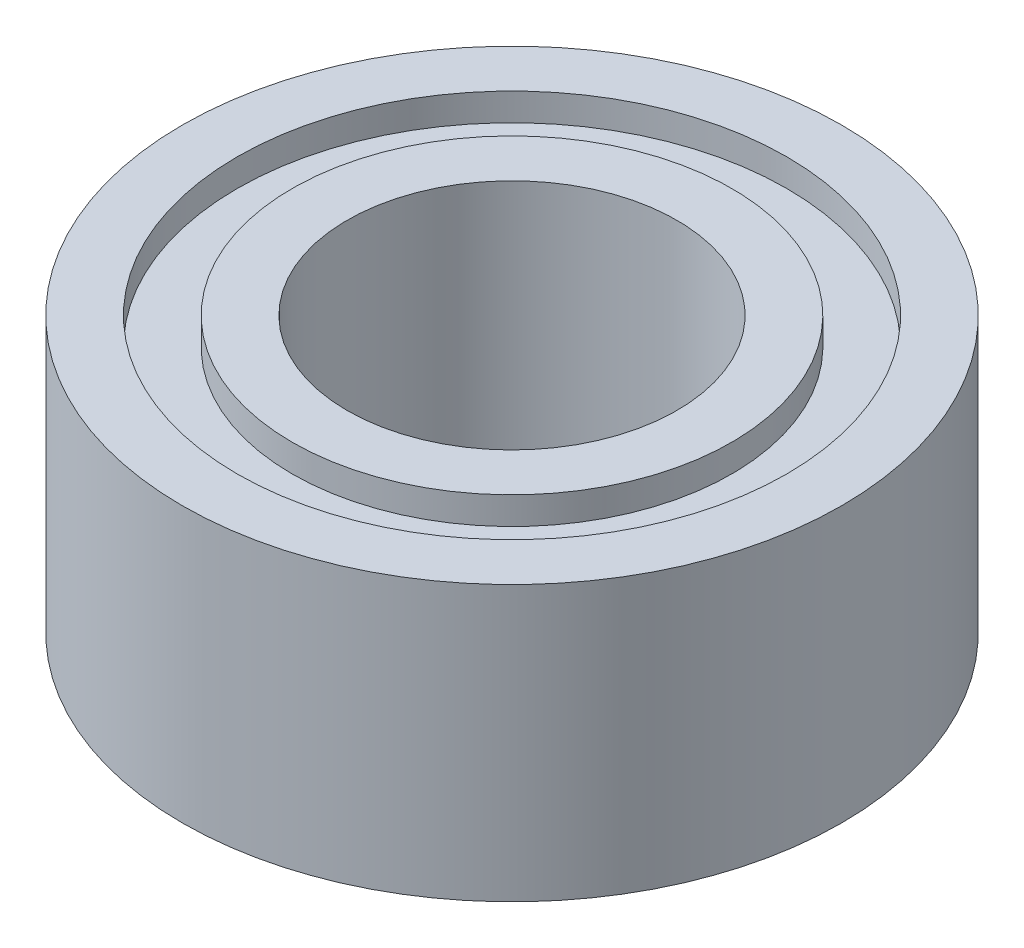
ISO-10303-21;
HEADER;
FILE_DESCRIPTION(('STEP AP214'),'2;1');
FILE_NAME('part.step','',(''),(''),'','','');
FILE_SCHEMA(('AUTOMOTIVE_DESIGN { 1 0 10303 214 1 1 1 1 }'));
ENDSEC;
DATA;
#1=APPLICATION_CONTEXT('core data for automotive mechanical design processes');
#2=APPLICATION_PROTOCOL_DEFINITION('international standard','automotive_design',2000,#1);
#3=PRODUCT_CONTEXT('',#1,'mechanical');
#4=PRODUCT('Part','Part','',(#3));
#5=PRODUCT_RELATED_PRODUCT_CATEGORY('part','',(#4));
#6=PRODUCT_DEFINITION_FORMATION('','',#4);
#7=PRODUCT_DEFINITION_CONTEXT('part definition',#1,'design');
#8=PRODUCT_DEFINITION('design','',#6,#7);
#9=PRODUCT_DEFINITION_SHAPE('','',#8);
#10=(LENGTH_UNIT() NAMED_UNIT(*) SI_UNIT(.MILLI.,.METRE.));
#11=(NAMED_UNIT(*) PLANE_ANGLE_UNIT() SI_UNIT($,.RADIAN.));
#12=(NAMED_UNIT(*) SI_UNIT($,.STERADIAN.) SOLID_ANGLE_UNIT());
#13=UNCERTAINTY_MEASURE_WITH_UNIT(LENGTH_MEASURE(1.E-05),#10,'distance_accuracy_value','');
#14=(GEOMETRIC_REPRESENTATION_CONTEXT(3) GLOBAL_UNCERTAINTY_ASSIGNED_CONTEXT((#13)) GLOBAL_UNIT_ASSIGNED_CONTEXT((#10,
#11,#12)) REPRESENTATION_CONTEXT('',''));
#15=CARTESIAN_POINT('',(0.,0.,0.));
#16=DIRECTION('',(0.,0.,1.));
#17=DIRECTION('',(1.,0.,0.));
#18=AXIS2_PLACEMENT_3D('',#15,#16,#17);
#19=CARTESIAN_POINT('',(0.,-1.25,0.));
#20=DIRECTION('',(0.,1.,0.));
#21=DIRECTION('',(0.,0.,1.));
#22=AXIS2_PLACEMENT_3D('',#19,#20,#21);
#23=CYLINDRICAL_SURFACE('',#22,2.);
#24=CARTESIAN_POINT('',(0.,-1.25,0.));
#25=DIRECTION('',(0.,1.,0.));
#26=DIRECTION('',(0.,0.,1.));
#27=AXIS2_PLACEMENT_3D('',#24,#25,#26);
#28=CIRCLE('',#27,2.);
#29=CARTESIAN_POINT('',(0.,-1.25,2.));
#30=VERTEX_POINT('',#29);
#31=EDGE_CURVE('E41',#30,#30,#28,.T.);
#32=ORIENTED_EDGE('',*,*,#31,.T.);
#33=EDGE_LOOP('',(#32));
#34=FACE_BOUND('',#33,.T.);
#35=CARTESIAN_POINT('',(0.,-1.,0.));
#36=DIRECTION('',(0.,1.,0.));
#37=DIRECTION('',(0.,0.,1.));
#38=AXIS2_PLACEMENT_3D('',#35,#36,#37);
#39=CIRCLE('',#38,2.);
#40=CARTESIAN_POINT('',(0.,-1.,2.));
#41=VERTEX_POINT('',#40);
#42=EDGE_CURVE('E60',#41,#41,#39,.T.);
#43=ORIENTED_EDGE('',*,*,#42,.F.);
#44=EDGE_LOOP('',(#43));
#45=FACE_BOUND('',#44,.T.);
#46=ADVANCED_FACE('F34',(#34,#45),#23,.T.);
#47=CARTESIAN_POINT('',(0.,1.,0.));
#48=DIRECTION('',(0.,1.,0.));
#49=DIRECTION('',(0.,0.,1.));
#50=AXIS2_PLACEMENT_3D('',#47,#48,#49);
#51=CIRCLE('',#50,2.);
#52=CARTESIAN_POINT('',(0.,1.,2.));
#53=VERTEX_POINT('',#52);
#54=EDGE_CURVE('E10',#53,#53,#51,.F.);
#55=ORIENTED_EDGE('',*,*,#54,.F.);
#56=EDGE_LOOP('',(#55));
#57=FACE_BOUND('',#56,.T.);
#58=CARTESIAN_POINT('',(0.,1.25,0.));
#59=DIRECTION('',(0.,1.,0.));
#60=DIRECTION('',(0.,0.,1.));
#61=AXIS2_PLACEMENT_3D('',#58,#59,#60);
#62=CIRCLE('',#61,2.);
#63=CARTESIAN_POINT('',(0.,1.25,2.));
#64=VERTEX_POINT('',#63);
#65=EDGE_CURVE('E49',#64,#64,#62,.T.);
#66=ORIENTED_EDGE('',*,*,#65,.F.);
#67=EDGE_LOOP('',(#66));
#68=FACE_BOUND('',#67,.T.);
#69=ADVANCED_FACE('F36',(#57,#68),#23,.T.);
#70=CARTESIAN_POINT('',(0.,-1.25,0.));
#71=DIRECTION('',(0.,1.,0.));
#72=DIRECTION('',(0.,0.,1.));
#73=AXIS2_PLACEMENT_3D('',#70,#71,#72);
#74=PLANE('',#73);
#75=CARTESIAN_POINT('',(0.,-1.25,0.));
#76=DIRECTION('',(0.,1.,0.));
#77=DIRECTION('',(0.,0.,1.));
#78=AXIS2_PLACEMENT_3D('',#75,#76,#77);
#79=CIRCLE('',#78,1.5);
#80=CARTESIAN_POINT('',(0.,-1.25,1.5));
#81=VERTEX_POINT('',#80);
#82=EDGE_CURVE('E45',#81,#81,#79,.T.);
#83=ORIENTED_EDGE('',*,*,#82,.T.);
#84=EDGE_LOOP('',(#83));
#85=FACE_BOUND('',#84,.T.);
#86=ORIENTED_EDGE('',*,*,#31,.F.);
#87=EDGE_LOOP('',(#86));
#88=FACE_BOUND('',#87,.T.);
#89=ADVANCED_FACE('F96',(#85,#88),#74,.F.);
#90=CARTESIAN_POINT('',(0.,-1.25,0.));
#91=DIRECTION('',(0.,1.,0.));
#92=DIRECTION('',(0.,0.,1.));
#93=AXIS2_PLACEMENT_3D('',#90,#91,#92);
#94=CYLINDRICAL_SURFACE('',#93,1.5);
#95=ORIENTED_EDGE('',*,*,#82,.F.);
#96=EDGE_LOOP('',(#95));
#97=FACE_BOUND('',#96,.T.);
#98=CARTESIAN_POINT('',(0.,1.25,0.));
#99=DIRECTION('',(0.,1.,0.));
#100=DIRECTION('',(0.,0.,1.));
#101=AXIS2_PLACEMENT_3D('',#98,#99,#100);
#102=CIRCLE('',#101,1.5);
#103=CARTESIAN_POINT('',(0.,1.25,1.5));
#104=VERTEX_POINT('',#103);
#105=EDGE_CURVE('E54',#104,#104,#102,.T.);
#106=ORIENTED_EDGE('',*,*,#105,.T.);
#107=EDGE_LOOP('',(#106));
#108=FACE_BOUND('',#107,.T.);
#109=ADVANCED_FACE('F127',(#97,#108),#94,.F.);
#110=CARTESIAN_POINT('',(0.,1.25,0.));
#111=DIRECTION('',(0.,1.,0.));
#112=DIRECTION('',(0.,0.,1.));
#113=AXIS2_PLACEMENT_3D('',#110,#111,#112);
#114=PLANE('',#113);
#115=ORIENTED_EDGE('',*,*,#65,.T.);
#116=EDGE_LOOP('',(#115));
#117=FACE_BOUND('',#116,.T.);
#118=ORIENTED_EDGE('',*,*,#105,.F.);
#119=EDGE_LOOP('',(#118));
#120=FACE_BOUND('',#119,.T.);
#121=ADVANCED_FACE('F105',(#117,#120),#114,.T.);
#122=CARTESIAN_POINT('',(0.,-1.,0.));
#123=DIRECTION('',(0.,1.,0.));
#124=DIRECTION('',(0.,0.,1.));
#125=AXIS2_PLACEMENT_3D('',#122,#123,#124);
#126=PLANE('',#125);
#127=ORIENTED_EDGE('',*,*,#42,.T.);
#128=EDGE_LOOP('',(#127));
#129=FACE_BOUND('',#128,.T.);
#130=CARTESIAN_POINT('',(0.,-1.,0.));
#131=DIRECTION('',(0.,1.,0.));
#132=DIRECTION('',(0.,0.,1.));
#133=AXIS2_PLACEMENT_3D('',#130,#131,#132);
#134=CIRCLE('',#133,2.5);
#135=CARTESIAN_POINT('',(0.,-1.,2.5));
#136=VERTEX_POINT('',#135);
#137=EDGE_CURVE('E57',#136,#136,#134,.T.);
#138=ORIENTED_EDGE('',*,*,#137,.F.);
#139=EDGE_LOOP('',(#138));
#140=FACE_BOUND('',#139,.T.);
#141=ADVANCED_FACE('F101',(#129,#140),#126,.F.);
#142=CARTESIAN_POINT('',(0.,1.,0.));
#143=DIRECTION('',(0.,1.,0.));
#144=DIRECTION('',(0.,0.,1.));
#145=AXIS2_PLACEMENT_3D('',#142,#143,#144);
#146=PLANE('',#145);
#147=CARTESIAN_POINT('',(0.,1.,0.));
#148=DIRECTION('',(0.,1.,0.));
#149=DIRECTION('',(0.,0.,1.));
#150=AXIS2_PLACEMENT_3D('',#147,#148,#149);
#151=CIRCLE('',#150,2.5);
#152=CARTESIAN_POINT('',(0.,1.,2.5));
#153=VERTEX_POINT('',#152);
#154=EDGE_CURVE('E63',#153,#153,#151,.T.);
#155=ORIENTED_EDGE('',*,*,#154,.T.);
#156=EDGE_LOOP('',(#155));
#157=FACE_BOUND('',#156,.T.);
#158=ORIENTED_EDGE('',*,*,#54,.T.);
#159=EDGE_LOOP('',(#158));
#160=FACE_BOUND('',#159,.T.);
#161=ADVANCED_FACE('F104',(#157,#160),#146,.T.);
#162=CARTESIAN_POINT('',(0.,-1.25,0.));
#163=DIRECTION('',(0.,1.,0.));
#164=DIRECTION('',(0.,0.,1.));
#165=AXIS2_PLACEMENT_3D('',#162,#163,#164);
#166=CYLINDRICAL_SURFACE('',#165,2.5);
#167=CARTESIAN_POINT('',(0.,-1.25,0.));
#168=DIRECTION('',(0.,1.,0.));
#169=DIRECTION('',(0.,0.,1.));
#170=AXIS2_PLACEMENT_3D('',#167,#168,#169);
#171=CIRCLE('',#170,2.5);
#172=CARTESIAN_POINT('',(0.,-1.25,2.5));
#173=VERTEX_POINT('',#172);
#174=EDGE_CURVE('E69',#173,#173,#171,.T.);
#175=ORIENTED_EDGE('',*,*,#174,.F.);
#176=EDGE_LOOP('',(#175));
#177=FACE_BOUND('',#176,.T.);
#178=ORIENTED_EDGE('',*,*,#137,.T.);
#179=EDGE_LOOP('',(#178));
#180=FACE_BOUND('',#179,.T.);
#181=ADVANCED_FACE('F91',(#177,#180),#166,.F.);
#182=CARTESIAN_POINT('',(0.,-1.25,0.));
#183=DIRECTION('',(0.,1.,0.));
#184=DIRECTION('',(0.,0.,1.));
#185=AXIS2_PLACEMENT_3D('',#182,#183,#184);
#186=CYLINDRICAL_SURFACE('',#185,3.);
#187=CARTESIAN_POINT('',(0.,-1.25,0.));
#188=DIRECTION('',(0.,1.,0.));
#189=DIRECTION('',(0.,0.,1.));
#190=AXIS2_PLACEMENT_3D('',#187,#188,#189);
#191=CIRCLE('',#190,3.);
#192=CARTESIAN_POINT('',(0.,-1.25,3.));
#193=VERTEX_POINT('',#192);
#194=EDGE_CURVE('E66',#193,#193,#191,.T.);
#195=ORIENTED_EDGE('',*,*,#194,.T.);
#196=EDGE_LOOP('',(#195));
#197=FACE_BOUND('',#196,.T.);
#198=CARTESIAN_POINT('',(0.,1.25,0.));
#199=DIRECTION('',(0.,1.,0.));
#200=DIRECTION('',(0.,0.,1.));
#201=AXIS2_PLACEMENT_3D('',#198,#199,#200);
#202=CIRCLE('',#201,3.);
#203=CARTESIAN_POINT('',(0.,1.25,3.));
#204=VERTEX_POINT('',#203);
#205=EDGE_CURVE('E72',#204,#204,#202,.T.);
#206=ORIENTED_EDGE('',*,*,#205,.F.);
#207=EDGE_LOOP('',(#206));
#208=FACE_BOUND('',#207,.T.);
#209=ADVANCED_FACE('F110',(#197,#208),#186,.T.);
#210=CARTESIAN_POINT('',(0.,-1.25,0.));
#211=DIRECTION('',(0.,1.,0.));
#212=DIRECTION('',(0.,0.,1.));
#213=AXIS2_PLACEMENT_3D('',#210,#211,#212);
#214=PLANE('',#213);
#215=ORIENTED_EDGE('',*,*,#174,.T.);
#216=EDGE_LOOP('',(#215));
#217=FACE_BOUND('',#216,.T.);
#218=ORIENTED_EDGE('',*,*,#194,.F.);
#219=EDGE_LOOP('',(#218));
#220=FACE_BOUND('',#219,.T.);
#221=ADVANCED_FACE('F88',(#217,#220),#214,.F.);
#222=ORIENTED_EDGE('',*,*,#154,.F.);
#223=EDGE_LOOP('',(#222));
#224=FACE_BOUND('',#223,.T.);
#225=CARTESIAN_POINT('',(0.,1.25,0.));
#226=DIRECTION('',(0.,1.,0.));
#227=DIRECTION('',(0.,0.,1.));
#228=AXIS2_PLACEMENT_3D('',#225,#226,#227);
#229=CIRCLE('',#228,2.5);
#230=CARTESIAN_POINT('',(0.,1.25,2.5));
#231=VERTEX_POINT('',#230);
#232=EDGE_CURVE('E75',#231,#231,#229,.T.);
#233=ORIENTED_EDGE('',*,*,#232,.T.);
#234=EDGE_LOOP('',(#233));
#235=FACE_BOUND('',#234,.T.);
#236=ADVANCED_FACE('F79',(#224,#235),#166,.F.);
#237=CARTESIAN_POINT('',(0.,1.25,0.));
#238=DIRECTION('',(0.,1.,0.));
#239=DIRECTION('',(0.,0.,1.));
#240=AXIS2_PLACEMENT_3D('',#237,#238,#239);
#241=PLANE('',#240);
#242=ORIENTED_EDGE('',*,*,#205,.T.);
#243=EDGE_LOOP('',(#242));
#244=FACE_BOUND('',#243,.T.);
#245=ORIENTED_EDGE('',*,*,#232,.F.);
#246=EDGE_LOOP('',(#245));
#247=FACE_BOUND('',#246,.T.);
#248=ADVANCED_FACE('F81',(#244,#247),#241,.T.);
#249=CLOSED_SHELL('',(#46,#69,#89,#109,#121,#141,#161,#181,#209,#221,#236,#248));
#250=MANIFOLD_SOLID_BREP('B2',#249);
#251=ADVANCED_BREP_SHAPE_REPRESENTATION('',(#18,#250),#14);
#252=SHAPE_DEFINITION_REPRESENTATION(#9,#251);
ENDSEC;
END-ISO-10303-21;
